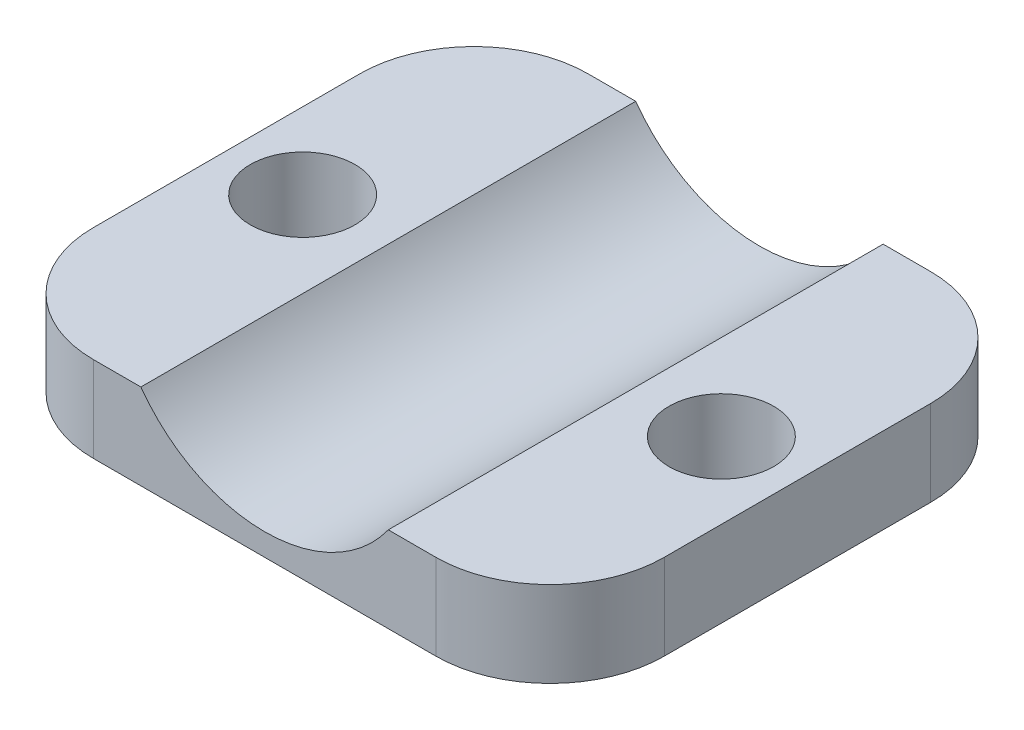
ISO-10303-21;
HEADER;
FILE_DESCRIPTION(('STEP AP214'),'2;1');
FILE_NAME('part.step','',(''),(''),'','','');
FILE_SCHEMA(('AUTOMOTIVE_DESIGN { 1 0 10303 214 1 1 1 1 }'));
ENDSEC;
DATA;
#1=APPLICATION_CONTEXT('core data for automotive mechanical design processes');
#2=APPLICATION_PROTOCOL_DEFINITION('international standard','automotive_design',2000,#1);
#3=PRODUCT_CONTEXT('',#1,'mechanical');
#4=PRODUCT('Part','Part','',(#3));
#5=PRODUCT_RELATED_PRODUCT_CATEGORY('part','',(#4));
#6=PRODUCT_DEFINITION_FORMATION('','',#4);
#7=PRODUCT_DEFINITION_CONTEXT('part definition',#1,'design');
#8=PRODUCT_DEFINITION('design','',#6,#7);
#9=PRODUCT_DEFINITION_SHAPE('','',#8);
#10=(LENGTH_UNIT() NAMED_UNIT(*) SI_UNIT(.MILLI.,.METRE.));
#11=(NAMED_UNIT(*) PLANE_ANGLE_UNIT() SI_UNIT($,.RADIAN.));
#12=(NAMED_UNIT(*) SI_UNIT($,.STERADIAN.) SOLID_ANGLE_UNIT());
#13=UNCERTAINTY_MEASURE_WITH_UNIT(LENGTH_MEASURE(1.E-05),#10,'distance_accuracy_value','');
#14=(GEOMETRIC_REPRESENTATION_CONTEXT(3) GLOBAL_UNCERTAINTY_ASSIGNED_CONTEXT((#13)) GLOBAL_UNIT_ASSIGNED_CONTEXT((#10,
#11,#12)) REPRESENTATION_CONTEXT('',''));
#15=CARTESIAN_POINT('',(0.,0.,0.));
#16=DIRECTION('',(0.,0.,1.));
#17=DIRECTION('',(1.,0.,0.));
#18=AXIS2_PLACEMENT_3D('',#15,#16,#17);
#19=CARTESIAN_POINT('',(30.,4.5,0.));
#20=DIRECTION('',(0.,1.,0.));
#21=DIRECTION('',(0.,0.,1.));
#22=AXIS2_PLACEMENT_3D('',#19,#20,#21);
#23=PLANE('',#22);
#24=CARTESIAN_POINT('',(4.,4.5,-13.));
#25=DIRECTION('',(0.,1.,0.));
#26=DIRECTION('',(0.,0.,1.));
#27=AXIS2_PLACEMENT_3D('',#24,#25,#26);
#28=CIRCLE('',#27,2.74999999999999);
#29=CARTESIAN_POINT('',(4.,4.5,-10.25));
#30=VERTEX_POINT('',#29);
#31=EDGE_CURVE('E167',#30,#30,#28,.T.);
#32=ORIENTED_EDGE('',*,*,#31,.F.);
#33=EDGE_LOOP('',(#32));
#34=FACE_BOUND('',#33,.T.);
#35=DIRECTION('',(-1.,0.,0.));
#36=VECTOR('',#35,1.);
#37=CARTESIAN_POINT('',(0.,4.5,-26.));
#38=LINE('',#37,#36);
#39=CARTESIAN_POINT('',(8.5,4.5,-26.));
#40=VERTEX_POINT('',#39);
#41=CARTESIAN_POINT('',(6.,4.5,-26.));
#42=VERTEX_POINT('',#41);
#43=EDGE_CURVE('E124',#40,#42,#38,.T.);
#44=ORIENTED_EDGE('',*,*,#43,.T.);
#45=CARTESIAN_POINT('',(6.,4.5,-20.));
#46=DIRECTION('',(0.,1.,0.));
#47=DIRECTION('',(0.,0.,1.));
#48=AXIS2_PLACEMENT_3D('',#45,#46,#47);
#49=CIRCLE('',#48,6.);
#50=CARTESIAN_POINT('',(0.,4.5,-20.));
#51=VERTEX_POINT('',#50);
#52=EDGE_CURVE('E186',#42,#51,#49,.T.);
#53=ORIENTED_EDGE('',*,*,#52,.T.);
#54=DIRECTION('',(0.,0.,1.));
#55=VECTOR('',#54,1.);
#56=CARTESIAN_POINT('',(0.,4.5,0.));
#57=LINE('',#56,#55);
#58=CARTESIAN_POINT('',(0.,4.5,-6.));
#59=VERTEX_POINT('',#58);
#60=EDGE_CURVE('E123',#51,#59,#57,.T.);
#61=ORIENTED_EDGE('',*,*,#60,.T.);
#62=CARTESIAN_POINT('',(6.,4.5,-6.));
#63=DIRECTION('',(0.,1.,0.));
#64=DIRECTION('',(0.,0.,1.));
#65=AXIS2_PLACEMENT_3D('',#62,#63,#64);
#66=CIRCLE('',#65,6.);
#67=CARTESIAN_POINT('',(6.,4.5,0.));
#68=VERTEX_POINT('',#67);
#69=EDGE_CURVE('E184',#59,#68,#66,.T.);
#70=ORIENTED_EDGE('',*,*,#69,.T.);
#71=DIRECTION('',(1.,0.,0.));
#72=VECTOR('',#71,1.);
#73=CARTESIAN_POINT('',(0.,4.5,0.));
#74=LINE('',#73,#72);
#75=CARTESIAN_POINT('',(8.5,4.5,0.));
#76=VERTEX_POINT('',#75);
#77=EDGE_CURVE('E147',#68,#76,#74,.T.);
#78=ORIENTED_EDGE('',*,*,#77,.T.);
#79=DIRECTION('',(0.,0.,1.));
#80=VECTOR('',#79,1.);
#81=CARTESIAN_POINT('',(8.5,4.5,-26.));
#82=LINE('',#81,#80);
#83=EDGE_CURVE('E133',#40,#76,#82,.T.);
#84=ORIENTED_EDGE('',*,*,#83,.F.);
#85=EDGE_LOOP('',(#44,#53,#61,#70,#78,#84));
#86=FACE_BOUND('',#85,.T.);
#87=ADVANCED_FACE('F33',(#34,#86),#23,.T.);
#88=CARTESIAN_POINT('',(0.,4.5,0.));
#89=DIRECTION('',(0.,0.,-1.));
#90=DIRECTION('',(-1.,0.,0.));
#91=AXIS2_PLACEMENT_3D('',#88,#89,#90);
#92=PLANE('',#91);
#93=ORIENTED_EDGE('',*,*,#77,.F.);
#94=DIRECTION('',(0.,-1.,0.));
#95=VECTOR('',#94,1.);
#96=CARTESIAN_POINT('',(6.,4.5,0.));
#97=LINE('',#96,#95);
#98=CARTESIAN_POINT('',(6.,0.,0.));
#99=VERTEX_POINT('',#98);
#100=EDGE_CURVE('E11',#68,#99,#97,.T.);
#101=ORIENTED_EDGE('',*,*,#100,.T.);
#102=DIRECTION('',(1.,0.,0.));
#103=VECTOR('',#102,1.);
#104=CARTESIAN_POINT('',(0.,0.,0.));
#105=LINE('',#104,#103);
#106=CARTESIAN_POINT('',(24.,0.,0.));
#107=VERTEX_POINT('',#106);
#108=EDGE_CURVE('E145',#99,#107,#105,.T.);
#109=ORIENTED_EDGE('',*,*,#108,.T.);
#110=DIRECTION('',(0.,-1.,0.));
#111=VECTOR('',#110,1.);
#112=CARTESIAN_POINT('',(24.,4.5,0.));
#113=LINE('',#112,#111);
#114=CARTESIAN_POINT('',(24.,4.5,0.));
#115=VERTEX_POINT('',#114);
#116=EDGE_CURVE('E41',#107,#115,#113,.F.);
#117=ORIENTED_EDGE('',*,*,#116,.T.);
#118=CARTESIAN_POINT('',(21.5,4.5,0.));
#119=VERTEX_POINT('',#118);
#120=EDGE_CURVE('E150',#119,#115,#74,.T.);
#121=ORIENTED_EDGE('',*,*,#120,.F.);
#122=CARTESIAN_POINT('',(15.,9.16368952654441,0.));
#123=DIRECTION('',(0.,0.,1.));
#124=DIRECTION('',(1.,0.,0.));
#125=AXIS2_PLACEMENT_3D('',#122,#123,#124);
#126=CIRCLE('',#125,8.);
#127=EDGE_CURVE('E132',#76,#119,#126,.T.);
#128=ORIENTED_EDGE('',*,*,#127,.F.);
#129=EDGE_LOOP('',(#93,#101,#109,#117,#121,#128));
#130=FACE_BOUND('',#129,.T.);
#131=ADVANCED_FACE('F204',(#130),#92,.F.);
#132=CARTESIAN_POINT('',(30.,4.5,0.));
#133=DIRECTION('',(-1.,0.,0.));
#134=DIRECTION('',(0.,0.,1.));
#135=AXIS2_PLACEMENT_3D('',#132,#133,#134);
#136=PLANE('',#135);
#137=DIRECTION('',(0.,0.,-1.));
#138=VECTOR('',#137,1.);
#139=CARTESIAN_POINT('',(30.,0.,0.));
#140=LINE('',#139,#138);
#141=CARTESIAN_POINT('',(30.,0.,-6.));
#142=VERTEX_POINT('',#141);
#143=CARTESIAN_POINT('',(30.,0.,-20.));
#144=VERTEX_POINT('',#143);
#145=EDGE_CURVE('E156',#142,#144,#140,.T.);
#146=ORIENTED_EDGE('',*,*,#145,.T.);
#147=DIRECTION('',(0.,-1.,0.));
#148=VECTOR('',#147,1.);
#149=CARTESIAN_POINT('',(30.,4.5,-20.));
#150=LINE('',#149,#148);
#151=CARTESIAN_POINT('',(30.,4.5,-20.));
#152=VERTEX_POINT('',#151);
#153=EDGE_CURVE('E55',#144,#152,#150,.F.);
#154=ORIENTED_EDGE('',*,*,#153,.T.);
#155=DIRECTION('',(0.,0.,-1.));
#156=VECTOR('',#155,1.);
#157=CARTESIAN_POINT('',(30.,4.5,0.));
#158=LINE('',#157,#156);
#159=CARTESIAN_POINT('',(30.,4.5,-6.));
#160=VERTEX_POINT('',#159);
#161=EDGE_CURVE('E149',#160,#152,#158,.T.);
#162=ORIENTED_EDGE('',*,*,#161,.F.);
#163=DIRECTION('',(0.,-1.,0.));
#164=VECTOR('',#163,1.);
#165=CARTESIAN_POINT('',(30.,4.5,-6.));
#166=LINE('',#165,#164);
#167=EDGE_CURVE('E188',#160,#142,#166,.T.);
#168=ORIENTED_EDGE('',*,*,#167,.T.);
#169=EDGE_LOOP('',(#146,#154,#162,#168));
#170=FACE_BOUND('',#169,.T.);
#171=ADVANCED_FACE('F197',(#170),#136,.F.);
#172=CARTESIAN_POINT('',(0.,4.5,-26.));
#173=DIRECTION('',(0.,0.,1.));
#174=DIRECTION('',(1.,0.,0.));
#175=AXIS2_PLACEMENT_3D('',#172,#173,#174);
#176=PLANE('',#175);
#177=DIRECTION('',(-1.,0.,0.));
#178=VECTOR('',#177,1.);
#179=CARTESIAN_POINT('',(0.,0.,-26.));
#180=LINE('',#179,#178);
#181=CARTESIAN_POINT('',(24.,0.,-26.));
#182=VERTEX_POINT('',#181);
#183=CARTESIAN_POINT('',(6.,0.,-26.));
#184=VERTEX_POINT('',#183);
#185=EDGE_CURVE('E158',#182,#184,#180,.T.);
#186=ORIENTED_EDGE('',*,*,#185,.T.);
#187=DIRECTION('',(0.,-1.,0.));
#188=VECTOR('',#187,1.);
#189=CARTESIAN_POINT('',(6.,4.5,-26.));
#190=LINE('',#189,#188);
#191=EDGE_CURVE('E182',#184,#42,#190,.F.);
#192=ORIENTED_EDGE('',*,*,#191,.T.);
#193=ORIENTED_EDGE('',*,*,#43,.F.);
#194=CARTESIAN_POINT('',(15.,9.16368952654441,-26.));
#195=DIRECTION('',(0.,0.,1.));
#196=DIRECTION('',(1.,0.,0.));
#197=AXIS2_PLACEMENT_3D('',#194,#195,#196);
#198=CIRCLE('',#197,8.);
#199=CARTESIAN_POINT('',(21.5,4.5,-26.));
#200=VERTEX_POINT('',#199);
#201=EDGE_CURVE('E129',#40,#200,#198,.T.);
#202=ORIENTED_EDGE('',*,*,#201,.T.);
#203=CARTESIAN_POINT('',(24.,4.5,-26.));
#204=VERTEX_POINT('',#203);
#205=EDGE_CURVE('E113',#204,#200,#38,.T.);
#206=ORIENTED_EDGE('',*,*,#205,.F.);
#207=DIRECTION('',(0.,-1.,0.));
#208=VECTOR('',#207,1.);
#209=CARTESIAN_POINT('',(24.,4.5,-26.));
#210=LINE('',#209,#208);
#211=EDGE_CURVE('E180',#204,#182,#210,.T.);
#212=ORIENTED_EDGE('',*,*,#211,.T.);
#213=EDGE_LOOP('',(#186,#192,#193,#202,#206,#212));
#214=FACE_BOUND('',#213,.T.);
#215=ADVANCED_FACE('F137',(#214),#176,.F.);
#216=CARTESIAN_POINT('',(0.,4.5,0.));
#217=DIRECTION('',(1.,0.,0.));
#218=DIRECTION('',(0.,0.,-1.));
#219=AXIS2_PLACEMENT_3D('',#216,#217,#218);
#220=PLANE('',#219);
#221=ORIENTED_EDGE('',*,*,#60,.F.);
#222=DIRECTION('',(0.,-1.,0.));
#223=VECTOR('',#222,1.);
#224=CARTESIAN_POINT('',(0.,4.5,-20.));
#225=LINE('',#224,#223);
#226=CARTESIAN_POINT('',(0.,0.,-20.));
#227=VERTEX_POINT('',#226);
#228=EDGE_CURVE('E169',#51,#227,#225,.T.);
#229=ORIENTED_EDGE('',*,*,#228,.T.);
#230=DIRECTION('',(0.,0.,1.));
#231=VECTOR('',#230,1.);
#232=CARTESIAN_POINT('',(0.,0.,0.));
#233=LINE('',#232,#231);
#234=CARTESIAN_POINT('',(0.,0.,-6.));
#235=VERTEX_POINT('',#234);
#236=EDGE_CURVE('E160',#227,#235,#233,.T.);
#237=ORIENTED_EDGE('',*,*,#236,.T.);
#238=DIRECTION('',(0.,-1.,0.));
#239=VECTOR('',#238,1.);
#240=CARTESIAN_POINT('',(0.,4.5,-6.));
#241=LINE('',#240,#239);
#242=EDGE_CURVE('E154',#235,#59,#241,.F.);
#243=ORIENTED_EDGE('',*,*,#242,.T.);
#244=EDGE_LOOP('',(#221,#229,#237,#243));
#245=FACE_BOUND('',#244,.T.);
#246=ADVANCED_FACE('F212',(#245),#220,.F.);
#247=CARTESIAN_POINT('',(26.,4.5,-13.));
#248=DIRECTION('',(0.,1.,0.));
#249=DIRECTION('',(0.,0.,1.));
#250=AXIS2_PLACEMENT_3D('',#247,#248,#249);
#251=CIRCLE('',#250,2.74999999999999);
#252=CARTESIAN_POINT('',(26.,4.5,-10.25));
#253=VERTEX_POINT('',#252);
#254=EDGE_CURVE('E166',#253,#253,#251,.T.);
#255=ORIENTED_EDGE('',*,*,#254,.F.);
#256=EDGE_LOOP('',(#255));
#257=FACE_BOUND('',#256,.T.);
#258=ORIENTED_EDGE('',*,*,#161,.T.);
#259=CARTESIAN_POINT('',(24.,4.5,-20.));
#260=DIRECTION('',(0.,1.,0.));
#261=DIRECTION('',(0.,0.,1.));
#262=AXIS2_PLACEMENT_3D('',#259,#260,#261);
#263=CIRCLE('',#262,6.);
#264=EDGE_CURVE('E118',#152,#204,#263,.T.);
#265=ORIENTED_EDGE('',*,*,#264,.T.);
#266=ORIENTED_EDGE('',*,*,#205,.T.);
#267=DIRECTION('',(0.,0.,1.));
#268=VECTOR('',#267,1.);
#269=CARTESIAN_POINT('',(21.5,4.5,-26.));
#270=LINE('',#269,#268);
#271=EDGE_CURVE('E116',#200,#119,#270,.T.);
#272=ORIENTED_EDGE('',*,*,#271,.T.);
#273=ORIENTED_EDGE('',*,*,#120,.T.);
#274=CARTESIAN_POINT('',(24.,4.5,-6.));
#275=DIRECTION('',(0.,1.,0.));
#276=DIRECTION('',(0.,0.,1.));
#277=AXIS2_PLACEMENT_3D('',#274,#275,#276);
#278=CIRCLE('',#277,6.);
#279=EDGE_CURVE('E192',#115,#160,#278,.T.);
#280=ORIENTED_EDGE('',*,*,#279,.T.);
#281=EDGE_LOOP('',(#258,#265,#266,#272,#273,#280));
#282=FACE_BOUND('',#281,.T.);
#283=ADVANCED_FACE('F115',(#257,#282),#23,.T.);
#284=CARTESIAN_POINT('',(30.,0.,0.));
#285=DIRECTION('',(0.,1.,0.));
#286=DIRECTION('',(0.,0.,1.));
#287=AXIS2_PLACEMENT_3D('',#284,#285,#286);
#288=PLANE('',#287);
#289=CARTESIAN_POINT('',(4.,0.,-13.));
#290=DIRECTION('',(0.,1.,0.));
#291=DIRECTION('',(0.,0.,1.));
#292=AXIS2_PLACEMENT_3D('',#289,#290,#291);
#293=CIRCLE('',#292,2.74999999999999);
#294=CARTESIAN_POINT('',(4.,0.,-10.25));
#295=VERTEX_POINT('',#294);
#296=EDGE_CURVE('E163',#295,#295,#293,.T.);
#297=ORIENTED_EDGE('',*,*,#296,.T.);
#298=EDGE_LOOP('',(#297));
#299=FACE_BOUND('',#298,.T.);
#300=CARTESIAN_POINT('',(26.,0.,-13.));
#301=DIRECTION('',(0.,1.,0.));
#302=DIRECTION('',(0.,0.,1.));
#303=AXIS2_PLACEMENT_3D('',#300,#301,#302);
#304=CIRCLE('',#303,2.74999999999999);
#305=CARTESIAN_POINT('',(26.,0.,-10.25));
#306=VERTEX_POINT('',#305);
#307=EDGE_CURVE('E140',#306,#306,#304,.T.);
#308=ORIENTED_EDGE('',*,*,#307,.T.);
#309=EDGE_LOOP('',(#308));
#310=FACE_BOUND('',#309,.T.);
#311=ORIENTED_EDGE('',*,*,#236,.F.);
#312=CARTESIAN_POINT('',(6.,0.,-20.));
#313=DIRECTION('',(0.,1.,0.));
#314=DIRECTION('',(0.,0.,1.));
#315=AXIS2_PLACEMENT_3D('',#312,#313,#314);
#316=CIRCLE('',#315,6.);
#317=EDGE_CURVE('E178',#227,#184,#316,.F.);
#318=ORIENTED_EDGE('',*,*,#317,.T.);
#319=ORIENTED_EDGE('',*,*,#185,.F.);
#320=CARTESIAN_POINT('',(24.,0.,-20.));
#321=DIRECTION('',(0.,1.,0.));
#322=DIRECTION('',(0.,0.,1.));
#323=AXIS2_PLACEMENT_3D('',#320,#321,#322);
#324=CIRCLE('',#323,6.);
#325=EDGE_CURVE('E176',#182,#144,#324,.F.);
#326=ORIENTED_EDGE('',*,*,#325,.T.);
#327=ORIENTED_EDGE('',*,*,#145,.F.);
#328=CARTESIAN_POINT('',(24.,0.,-6.));
#329=DIRECTION('',(0.,1.,0.));
#330=DIRECTION('',(0.,0.,1.));
#331=AXIS2_PLACEMENT_3D('',#328,#329,#330);
#332=CIRCLE('',#331,6.);
#333=EDGE_CURVE('E172',#142,#107,#332,.F.);
#334=ORIENTED_EDGE('',*,*,#333,.T.);
#335=ORIENTED_EDGE('',*,*,#108,.F.);
#336=CARTESIAN_POINT('',(6.,0.,-6.));
#337=DIRECTION('',(0.,1.,0.));
#338=DIRECTION('',(0.,0.,1.));
#339=AXIS2_PLACEMENT_3D('',#336,#337,#338);
#340=CIRCLE('',#339,6.);
#341=EDGE_CURVE('E174',#99,#235,#340,.F.);
#342=ORIENTED_EDGE('',*,*,#341,.T.);
#343=EDGE_LOOP('',(#311,#318,#319,#326,#327,#334,#335,#342));
#344=FACE_BOUND('',#343,.T.);
#345=ADVANCED_FACE('F202',(#299,#310,#344),#288,.F.);
#346=CARTESIAN_POINT('',(15.,9.16368952654441,-26.));
#347=DIRECTION('',(0.,0.,1.));
#348=DIRECTION('',(1.,0.,0.));
#349=AXIS2_PLACEMENT_3D('',#346,#347,#348);
#350=CYLINDRICAL_SURFACE('',#349,8.);
#351=ORIENTED_EDGE('',*,*,#127,.T.);
#352=ORIENTED_EDGE('',*,*,#271,.F.);
#353=ORIENTED_EDGE('',*,*,#201,.F.);
#354=ORIENTED_EDGE('',*,*,#83,.T.);
#355=EDGE_LOOP('',(#351,#352,#353,#354));
#356=FACE_BOUND('',#355,.T.);
#357=ADVANCED_FACE('F127',(#356),#350,.F.);
#358=CARTESIAN_POINT('',(26.,4.5,-13.));
#359=DIRECTION('',(0.,1.,0.));
#360=DIRECTION('',(0.,0.,1.));
#361=AXIS2_PLACEMENT_3D('',#358,#359,#360);
#362=CYLINDRICAL_SURFACE('',#361,2.74999999999999);
#363=ORIENTED_EDGE('',*,*,#254,.T.);
#364=EDGE_LOOP('',(#363));
#365=FACE_BOUND('',#364,.T.);
#366=ORIENTED_EDGE('',*,*,#307,.F.);
#367=EDGE_LOOP('',(#366));
#368=FACE_BOUND('',#367,.T.);
#369=ADVANCED_FACE('F257',(#365,#368),#362,.F.);
#370=CARTESIAN_POINT('',(4.,4.5,-13.));
#371=DIRECTION('',(0.,1.,0.));
#372=DIRECTION('',(0.,0.,1.));
#373=AXIS2_PLACEMENT_3D('',#370,#371,#372);
#374=CYLINDRICAL_SURFACE('',#373,2.74999999999999);
#375=ORIENTED_EDGE('',*,*,#31,.T.);
#376=EDGE_LOOP('',(#375));
#377=FACE_BOUND('',#376,.T.);
#378=ORIENTED_EDGE('',*,*,#296,.F.);
#379=EDGE_LOOP('',(#378));
#380=FACE_BOUND('',#379,.T.);
#381=ADVANCED_FACE('F227',(#377,#380),#374,.F.);
#382=CARTESIAN_POINT('',(6.,4.5,-20.));
#383=DIRECTION('',(0.,-1.,0.));
#384=DIRECTION('',(0.,0.,-1.));
#385=AXIS2_PLACEMENT_3D('',#382,#383,#384);
#386=CYLINDRICAL_SURFACE('',#385,6.);
#387=ORIENTED_EDGE('',*,*,#52,.F.);
#388=ORIENTED_EDGE('',*,*,#191,.F.);
#389=ORIENTED_EDGE('',*,*,#317,.F.);
#390=ORIENTED_EDGE('',*,*,#228,.F.);
#391=EDGE_LOOP('',(#387,#388,#389,#390));
#392=FACE_BOUND('',#391,.T.);
#393=ADVANCED_FACE('F216',(#392),#386,.T.);
#394=CARTESIAN_POINT('',(24.,4.5,-20.));
#395=DIRECTION('',(0.,-1.,0.));
#396=DIRECTION('',(0.,0.,-1.));
#397=AXIS2_PLACEMENT_3D('',#394,#395,#396);
#398=CYLINDRICAL_SURFACE('',#397,6.);
#399=ORIENTED_EDGE('',*,*,#264,.F.);
#400=ORIENTED_EDGE('',*,*,#153,.F.);
#401=ORIENTED_EDGE('',*,*,#325,.F.);
#402=ORIENTED_EDGE('',*,*,#211,.F.);
#403=EDGE_LOOP('',(#399,#400,#401,#402));
#404=FACE_BOUND('',#403,.T.);
#405=ADVANCED_FACE('F220',(#404),#398,.T.);
#406=CARTESIAN_POINT('',(6.,4.5,-6.));
#407=DIRECTION('',(0.,-1.,0.));
#408=DIRECTION('',(0.,0.,-1.));
#409=AXIS2_PLACEMENT_3D('',#406,#407,#408);
#410=CYLINDRICAL_SURFACE('',#409,6.);
#411=ORIENTED_EDGE('',*,*,#69,.F.);
#412=ORIENTED_EDGE('',*,*,#242,.F.);
#413=ORIENTED_EDGE('',*,*,#341,.F.);
#414=ORIENTED_EDGE('',*,*,#100,.F.);
#415=EDGE_LOOP('',(#411,#412,#413,#414));
#416=FACE_BOUND('',#415,.T.);
#417=ADVANCED_FACE('F208',(#416),#410,.T.);
#418=CARTESIAN_POINT('',(24.,4.5,-6.));
#419=DIRECTION('',(0.,-1.,0.));
#420=DIRECTION('',(0.,0.,-1.));
#421=AXIS2_PLACEMENT_3D('',#418,#419,#420);
#422=CYLINDRICAL_SURFACE('',#421,6.);
#423=ORIENTED_EDGE('',*,*,#279,.F.);
#424=ORIENTED_EDGE('',*,*,#116,.F.);
#425=ORIENTED_EDGE('',*,*,#333,.F.);
#426=ORIENTED_EDGE('',*,*,#167,.F.);
#427=EDGE_LOOP('',(#423,#424,#425,#426));
#428=FACE_BOUND('',#427,.T.);
#429=ADVANCED_FACE('F35',(#428),#422,.T.);
#430=CLOSED_SHELL('',(#87,#131,#171,#215,#246,#283,#345,#357,#369,#381,#393,#405,#417,#429));
#431=MANIFOLD_SOLID_BREP('B2',#430);
#432=ADVANCED_BREP_SHAPE_REPRESENTATION('',(#18,#431),#14);
#433=SHAPE_DEFINITION_REPRESENTATION(#9,#432);
ENDSEC;
END-ISO-10303-21;
